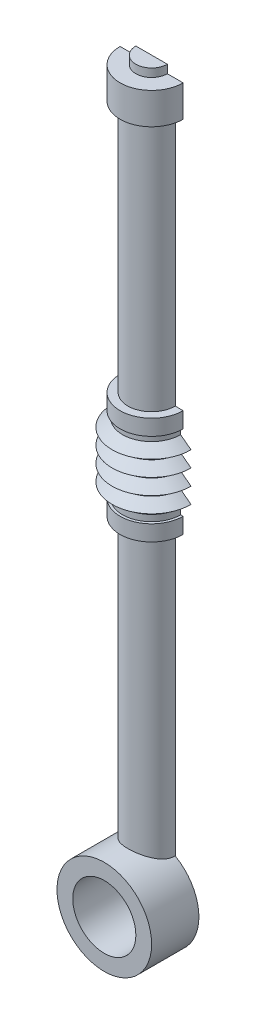
ISO-10303-21;
HEADER;
FILE_DESCRIPTION(('STEP AP214'),'2;1');
FILE_NAME('part.step','',(''),(''),'','','');
FILE_SCHEMA(('AUTOMOTIVE_DESIGN { 1 0 10303 214 1 1 1 1 }'));
ENDSEC;
DATA;
#1=APPLICATION_CONTEXT('core data for automotive mechanical design processes');
#2=APPLICATION_PROTOCOL_DEFINITION('international standard','automotive_design',2000,#1);
#3=PRODUCT_CONTEXT('',#1,'mechanical');
#4=PRODUCT('Part','Part','',(#3));
#5=PRODUCT_RELATED_PRODUCT_CATEGORY('part','',(#4));
#6=PRODUCT_DEFINITION_FORMATION('','',#4);
#7=PRODUCT_DEFINITION_CONTEXT('part definition',#1,'design');
#8=PRODUCT_DEFINITION('design','',#6,#7);
#9=PRODUCT_DEFINITION_SHAPE('','',#8);
#10=(LENGTH_UNIT() NAMED_UNIT(*) SI_UNIT(.MILLI.,.METRE.));
#11=(NAMED_UNIT(*) PLANE_ANGLE_UNIT() SI_UNIT($,.RADIAN.));
#12=(NAMED_UNIT(*) SI_UNIT($,.STERADIAN.) SOLID_ANGLE_UNIT());
#13=UNCERTAINTY_MEASURE_WITH_UNIT(LENGTH_MEASURE(1.E-05),#10,'distance_accuracy_value','');
#14=(GEOMETRIC_REPRESENTATION_CONTEXT(3) GLOBAL_UNCERTAINTY_ASSIGNED_CONTEXT((#13)) GLOBAL_UNIT_ASSIGNED_CONTEXT((#10,
#11,#12)) REPRESENTATION_CONTEXT('',''));
#15=CARTESIAN_POINT('',(0.,0.,0.));
#16=DIRECTION('',(0.,0.,1.));
#17=DIRECTION('',(1.,0.,0.));
#18=AXIS2_PLACEMENT_3D('',#15,#16,#17);
#19=CARTESIAN_POINT('',(0.,0.,-2.38125));
#20=DIRECTION('',(0.,0.,1.));
#21=DIRECTION('',(1.,0.,0.));
#22=AXIS2_PLACEMENT_3D('',#19,#20,#21);
#23=CYLINDRICAL_SURFACE('',#22,4.7625);
#24=CARTESIAN_POINT('',(0.,0.,0.));
#25=DIRECTION('',(0.,0.,1.));
#26=DIRECTION('',(1.,0.,0.));
#27=AXIS2_PLACEMENT_3D('',#24,#25,#26);
#28=CIRCLE('',#27,4.7625);
#29=CARTESIAN_POINT('',(2.38125,4.12444598552338,0.));
#30=VERTEX_POINT('',#29);
#31=CARTESIAN_POINT('',(-2.38125,4.12444598552338,0.));
#32=VERTEX_POINT('',#31);
#33=EDGE_CURVE('E53',#30,#32,#28,.F.);
#34=ORIENTED_EDGE('',*,*,#33,.F.);
#35=CARTESIAN_POINT('',(0.,4.7625,2.38125));
#36=CARTESIAN_POINT('',(-0.125183914923426,4.76249216616824,2.38124079022415));
#37=CARTESIAN_POINT('',(-0.250522391801445,4.75751079676351,2.37131965241024));
#38=CARTESIAN_POINT('',(-0.497492135528296,4.73807236179371,2.33207069034315));
#39=CARTESIAN_POINT('',(-0.61911590225731,4.72359730146256,2.30270601091892));
#40=CARTESIAN_POINT('',(-0.854710283828683,4.68668758103659,2.2260071468603));
#41=CARTESIAN_POINT('',(-0.968708640458038,4.66428387601664,2.17874279663695));
#42=CARTESIAN_POINT('',(-1.18698797780686,4.6135713226785,2.06794748374516));
#43=CARTESIAN_POINT('',(-1.29126972381591,4.58526293998811,2.0044178036293));
#44=CARTESIAN_POINT('',(-1.49425297381025,4.52333339410727,1.8585245421104));
#45=CARTESIAN_POINT('',(-1.59223521685329,4.48949442770284,1.77525406928113));
#46=CARTESIAN_POINT('',(-1.77350605772424,4.42102804302336,1.59419572957401));
#47=CARTESIAN_POINT('',(-1.85678345855757,4.3864000463997,1.49639690352979));
#48=CARTESIAN_POINT('',(-2.01275632468803,4.31718127493204,1.27996152334087));
#49=CARTESIAN_POINT('',(-2.08413032991234,4.2828016396047,1.16029716565166));
#50=CARTESIAN_POINT('',(-2.2054380906532,4.22162236963736,0.90876278134485));
#51=CARTESIAN_POINT('',(-2.25538716198478,4.19481732492304,0.776901556021107));
#52=CARTESIAN_POINT('',(-2.32917787787114,4.1542779588081,0.512766217674418));
#53=CARTESIAN_POINT('',(-2.35440344714868,4.13985721707925,0.380989398503949));
#54=CARTESIAN_POINT('',(-2.38226677784078,4.12389375440723,0.114350392548179));
#55=CARTESIAN_POINT('',(-2.38492686044446,4.12233830748904,-0.0205086129467756));
#56=CARTESIAN_POINT('',(-2.36859910257368,4.13172902674897,-0.272143595403314));
#57=CARTESIAN_POINT('',(-2.35216198239562,4.14120243470123,-0.389153474350517));
#58=CARTESIAN_POINT('',(-2.30252551556825,4.16900269672528,-0.618462796693928));
#59=CARTESIAN_POINT('',(-2.26932082940667,4.1873323709318,-0.730760727258112));
#60=CARTESIAN_POINT('',(-2.18648703954377,4.23118303207826,-0.95066437192215));
#61=CARTESIAN_POINT('',(-2.13649337856986,4.25686158081143,-1.05809986210871));
#62=CARTESIAN_POINT('',(-2.02178051875954,4.31252481445096,-1.26357290922991));
#63=CARTESIAN_POINT('',(-1.95705470557847,4.3425114313283,-1.3616062166477));
#64=CARTESIAN_POINT('',(-1.80514479326104,4.40800707257198,-1.55857873309482));
#65=CARTESIAN_POINT('',(-1.71615367899184,4.44373421251251,-1.65605668020323));
#66=CARTESIAN_POINT('',(-1.5229417218779,4.51360277984095,-1.83531371551958));
#67=CARTESIAN_POINT('',(-1.41871364221752,4.54774344351895,-1.91708530103068));
#68=CARTESIAN_POINT('',(-1.19185492951209,4.61252857217558,-2.06617648032704));
#69=CARTESIAN_POINT('',(-1.06859448999609,4.6429370603578,-2.13264862501142));
#70=CARTESIAN_POINT('',(-0.810735175632698,4.69482204419958,-2.24336855040867));
#71=CARTESIAN_POINT('',(-0.676145403481687,4.71630562984336,-2.28763397806736));
#72=CARTESIAN_POINT('',(-0.411400208267049,4.74641069721793,-2.34904455510034));
#73=CARTESIAN_POINT('',(-0.281800769618209,4.75595009329994,-2.36813225512202));
#74=CARTESIAN_POINT('',(-0.0209064223793881,4.7642386329949,-2.384737891014));
#75=CARTESIAN_POINT('',(0.110387653565244,4.7629928883014,-2.38226604517899));
#76=CARTESIAN_POINT('',(0.360123514541608,4.75038401553492,-2.35694532320286));
#77=CARTESIAN_POINT('',(0.478772715418814,4.73981253794951,-2.33569065643669));
#78=CARTESIAN_POINT('',(0.710581412294078,4.71064045443463,-2.27590809129975));
#79=CARTESIAN_POINT('',(0.823740301552203,4.69203896333817,-2.23737828863266));
#80=CARTESIAN_POINT('',(1.04510349887023,4.64782498678607,-2.14312865180629));
#81=CARTESIAN_POINT('',(1.15307363286889,4.62202724713937,-2.08694881191042));
#82=CARTESIAN_POINT('',(1.35841111754757,4.56590338843347,-1.95951268074179));
#83=CARTESIAN_POINT('',(1.45577392465991,4.53557534193758,-1.88824996699537));
#84=CARTESIAN_POINT('',(1.64727181011511,4.46980202056836,-1.72459548718051));
#85=CARTESIAN_POINT('',(1.7401510102877,4.4341466953364,-1.63081604451219));
#86=CARTESIAN_POINT('',(1.90942036468315,4.36393570018444,-1.42892823352271));
#87=CARTESIAN_POINT('',(1.98579911229707,4.32938080496145,-1.32081003575388));
#88=CARTESIAN_POINT('',(2.12337947127906,4.2636565144193,-1.0866985484896));
#89=CARTESIAN_POINT('',(2.18366696159152,4.23273211084819,-0.960093172570528));
#90=CARTESIAN_POINT('',(2.28143472953946,4.18085759649541,-0.696491651629047));
#91=CARTESIAN_POINT('',(2.3189443944635,4.15989464137303,-0.559509152757374));
#92=CARTESIAN_POINT('',(2.36663314232661,4.13293324320619,-0.29310753161418));
#93=CARTESIAN_POINT('',(2.37909019428893,4.12569144386626,-0.164224683502319));
#94=CARTESIAN_POINT('',(2.3828910522584,4.12350000729882,0.0939333281807322));
#95=CARTESIAN_POINT('',(2.37424400991589,4.12854504196533,0.223208297429794));
#96=CARTESIAN_POINT('',(2.33821157512933,4.14903909044237,0.465495089724903));
#97=CARTESIAN_POINT('',(2.31268975773311,4.16345118862044,0.578883000588989));
#98=CARTESIAN_POINT('',(2.24593636258125,4.19983482171594,0.799643078320496));
#99=CARTESIAN_POINT('',(2.20469973139119,4.22180878809312,0.907013297317141));
#100=CARTESIAN_POINT('',(2.10458608148048,4.27264188427817,1.12067545046553));
#101=CARTESIAN_POINT('',(2.04471002356456,4.30186440868521,1.2264102837776));
#102=CARTESIAN_POINT('',(1.91012262489561,4.36329131541278,1.42702239668615));
#103=CARTESIAN_POINT('',(1.83540356597009,4.39549724439656,1.52189398690387));
#104=CARTESIAN_POINT('',(1.66259405491127,4.46394665051477,1.71007598397153));
#105=CARTESIAN_POINT('',(1.56276696401922,4.50020523168019,1.80179601937323));
#106=CARTESIAN_POINT('',(1.34816645613201,4.56908865882827,1.96753719658021));
#107=CARTESIAN_POINT('',(1.23338503411081,4.60171154114937,2.0415487984721));
#108=CARTESIAN_POINT('',(0.990398154568059,4.66006004858537,2.16988737295861));
#109=CARTESIAN_POINT('',(0.862103521645129,4.68573527644208,2.22407146731469));
#110=CARTESIAN_POINT('',(0.663253095567626,4.71657007779491,2.28808012549976));
#111=CARTESIAN_POINT('',(0.595951068853118,4.72556504162985,2.30653151659672));
#112=CARTESIAN_POINT('',(0.459699357941892,4.74075563729533,2.33749781582299));
#113=CARTESIAN_POINT('',(0.390750707345512,4.74695297899059,2.35001635025922));
#114=CARTESIAN_POINT('',(0.268146547102141,4.75524386229739,2.36671244235111));
#115=CARTESIAN_POINT('',(0.21470159582656,4.75795932264298,2.37215832704609));
#116=CARTESIAN_POINT('',(0.107513940854614,4.761589098815,2.37942913381609));
#117=CARTESIAN_POINT('',(0.0537712289809023,4.76250336492721,2.38125395594727));
#118=CARTESIAN_POINT('',(0.,4.7625,2.38125));
#119=B_SPLINE_CURVE_WITH_KNOTS('',3,(#35,#36,#37,#38,#39,#40,#41,#42,#43,#44,#45,#46,#47,#48,
#49,#50,#51,#52,#53,#54,#55,#56,#57,#58,#59,#60,#61,#62,#63,#64,#65,#66,#67,#68,#69,#70,#71,#72,
#73,#74,#75,#76,#77,#78,#79,#80,#81,#82,#83,#84,#85,#86,#87,#88,#89,#90,#91,#92,#93,#94,#95,#96,
#97,#98,#99,#100,#101,#102,#103,#104,#105,#106,#107,#108,#109,#110,#111,#112,#113,#114,#115,
#116,#117,#118),.UNSPECIFIED.,.T.,.F.,(4,2,2,2,2,2,2,2,2,2,2,2,2,2,2,2,2,2,2,2,2,2,2,2,2,2,2,2,
2,2,2,2,2,2,2,2,2,2,2,2,2,4),(0.,0.375342762982071,0.751399031495027,1.12600300776604,
1.50057745488486,1.89781281294745,2.29534935341367,2.7237148606323,3.15177363432781,
3.55420641408922,3.9562410713973,4.31019852674695,4.66426876848022,5.0265863440121,
5.38906691250903,5.79750891551298,6.20614554263122,6.63375821648137,7.06103054022366,
7.45291460434892,7.84461294242952,8.20595196117703,8.56733082133655,8.93904238416433,
9.31091254594483,9.71930072847022,10.127970328905,10.5564308689761,10.984337440701,
11.3711666349163,11.7578281130277,12.1076544640509,12.4575934042726,12.8310431270806,
13.2046875497327,13.6237323431551,14.0430023792659,14.4652368253627,14.6760580296016,
14.8867502080478,15.0479696796956,15.2091936010515),.UNSPECIFIED.);
#120=EDGE_CURVE('E262',#30,#32,#119,.T.);
#121=ORIENTED_EDGE('',*,*,#120,.T.);
#122=EDGE_LOOP('',(#34,#121));
#123=FACE_BOUND('',#122,.T.);
#124=CARTESIAN_POINT('',(0.,0.,4.7625));
#125=DIRECTION('',(0.,0.,1.));
#126=DIRECTION('',(1.,0.,0.));
#127=AXIS2_PLACEMENT_3D('',#124,#125,#126);
#128=CIRCLE('',#127,4.7625);
#129=CARTESIAN_POINT('',(4.7625,0.,4.7625));
#130=VERTEX_POINT('',#129);
#131=EDGE_CURVE('E40',#130,#130,#128,.T.);
#132=ORIENTED_EDGE('',*,*,#131,.F.);
#133=EDGE_LOOP('',(#132));
#134=FACE_BOUND('',#133,.T.);
#135=ADVANCED_FACE('F33',(#123,#134),#23,.T.);
#136=CARTESIAN_POINT('',(0.,0.,-2.38125));
#137=DIRECTION('',(0.,0.,1.));
#138=DIRECTION('',(1.,0.,0.));
#139=AXIS2_PLACEMENT_3D('',#136,#137,#138);
#140=CYLINDRICAL_SURFACE('',#139,3.175);
#141=CARTESIAN_POINT('',(0.,0.,0.));
#142=DIRECTION('',(0.,0.,1.));
#143=DIRECTION('',(1.,0.,0.));
#144=AXIS2_PLACEMENT_3D('',#141,#142,#143);
#145=CIRCLE('',#144,3.175);
#146=CARTESIAN_POINT('',(3.175,0.,0.));
#147=VERTEX_POINT('',#146);
#148=EDGE_CURVE('E203',#147,#147,#145,.F.);
#149=CARTESIAN_POINT('',(0.,0.,4.7625));
#150=DIRECTION('',(0.,0.,1.));
#151=DIRECTION('',(1.,0.,0.));
#152=AXIS2_PLACEMENT_3D('',#149,#150,#151);
#153=CIRCLE('',#152,3.175);
#154=CARTESIAN_POINT('',(3.175,0.,4.7625));
#155=VERTEX_POINT('',#154);
#156=EDGE_CURVE('E269',#155,#155,#153,.T.);
#157=CARTESIAN_POINT('',(3.175,0.,0.));
#158=CARTESIAN_POINT('',(3.175,0.,0.049609375));
#159=CARTESIAN_POINT('',(3.175,0.,0.0992187500000001));
#160=CARTESIAN_POINT('',(3.175,0.,0.1984375));
#161=CARTESIAN_POINT('',(3.175,0.,0.248046875));
#162=CARTESIAN_POINT('',(3.175,0.,0.347265625));
#163=CARTESIAN_POINT('',(3.175,0.,0.396875));
#164=CARTESIAN_POINT('',(3.175,0.,0.49609375));
#165=CARTESIAN_POINT('',(3.175,0.,0.545703125));
#166=CARTESIAN_POINT('',(3.175,0.,0.644921875));
#167=CARTESIAN_POINT('',(3.175,0.,0.69453125));
#168=CARTESIAN_POINT('',(3.175,0.,0.79375));
#169=CARTESIAN_POINT('',(3.175,0.,0.843359375));
#170=CARTESIAN_POINT('',(3.175,0.,0.942578125));
#171=CARTESIAN_POINT('',(3.175,0.,0.9921875));
#172=CARTESIAN_POINT('',(3.175,0.,1.09140625));
#173=CARTESIAN_POINT('',(3.175,0.,1.141015625));
#174=CARTESIAN_POINT('',(3.175,0.,1.240234375));
#175=CARTESIAN_POINT('',(3.175,0.,1.28984375));
#176=CARTESIAN_POINT('',(3.175,0.,1.3890625));
#177=CARTESIAN_POINT('',(3.175,0.,1.438671875));
#178=CARTESIAN_POINT('',(3.175,0.,1.537890625));
#179=CARTESIAN_POINT('',(3.175,0.,1.5875));
#180=CARTESIAN_POINT('',(3.175,0.,1.68671875));
#181=CARTESIAN_POINT('',(3.175,0.,1.736328125));
#182=CARTESIAN_POINT('',(3.175,0.,1.835546875));
#183=CARTESIAN_POINT('',(3.175,0.,1.88515625));
#184=CARTESIAN_POINT('',(3.175,0.,1.984375));
#185=CARTESIAN_POINT('',(3.175,0.,2.033984375));
#186=CARTESIAN_POINT('',(3.175,0.,2.133203125));
#187=CARTESIAN_POINT('',(3.175,0.,2.1828125));
#188=CARTESIAN_POINT('',(3.175,0.,2.28203125));
#189=CARTESIAN_POINT('',(3.175,0.,2.331640625));
#190=CARTESIAN_POINT('',(3.175,0.,2.430859375));
#191=CARTESIAN_POINT('',(3.175,0.,2.48046875));
#192=CARTESIAN_POINT('',(3.175,0.,2.5796875));
#193=CARTESIAN_POINT('',(3.175,0.,2.629296875));
#194=CARTESIAN_POINT('',(3.175,0.,2.728515625));
#195=CARTESIAN_POINT('',(3.175,0.,2.778125));
#196=CARTESIAN_POINT('',(3.175,0.,2.87734375));
#197=CARTESIAN_POINT('',(3.175,0.,2.926953125));
#198=CARTESIAN_POINT('',(3.175,0.,3.026171875));
#199=CARTESIAN_POINT('',(3.175,0.,3.07578125));
#200=CARTESIAN_POINT('',(3.175,0.,3.175));
#201=CARTESIAN_POINT('',(3.175,0.,3.224609375));
#202=CARTESIAN_POINT('',(3.175,0.,3.323828125));
#203=CARTESIAN_POINT('',(3.175,0.,3.3734375));
#204=CARTESIAN_POINT('',(3.175,0.,3.47265625));
#205=CARTESIAN_POINT('',(3.175,0.,3.522265625));
#206=CARTESIAN_POINT('',(3.175,0.,3.621484375));
#207=CARTESIAN_POINT('',(3.175,0.,3.67109375));
#208=CARTESIAN_POINT('',(3.175,0.,3.7703125));
#209=CARTESIAN_POINT('',(3.175,0.,3.819921875));
#210=CARTESIAN_POINT('',(3.175,0.,3.919140625));
#211=CARTESIAN_POINT('',(3.175,0.,3.96875));
#212=CARTESIAN_POINT('',(3.175,0.,4.06796875));
#213=CARTESIAN_POINT('',(3.175,0.,4.117578125));
#214=CARTESIAN_POINT('',(3.175,0.,4.216796875));
#215=CARTESIAN_POINT('',(3.175,0.,4.26640625));
#216=CARTESIAN_POINT('',(3.175,0.,4.365625));
#217=CARTESIAN_POINT('',(3.175,0.,4.415234375));
#218=CARTESIAN_POINT('',(3.175,0.,4.514453125));
#219=CARTESIAN_POINT('',(3.175,0.,4.5640625));
#220=CARTESIAN_POINT('',(3.175,0.,4.66328125));
#221=CARTESIAN_POINT('',(3.175,0.,4.712890625));
#222=CARTESIAN_POINT('',(3.175,0.,4.7625));
#223=B_SPLINE_CURVE_WITH_KNOTS('',3,(#157,#158,#159,#160,#161,#162,#163,#164,#165,#166,#167,
#168,#169,#170,#171,#172,#173,#174,#175,#176,#177,#178,#179,#180,#181,#182,#183,#184,#185,#186,
#187,#188,#189,#190,#191,#192,#193,#194,#195,#196,#197,#198,#199,#200,#201,#202,#203,#204,#205,
#206,#207,#208,#209,#210,#211,#212,#213,#214,#215,#216,#217,#218,#219,#220,#221,#222),
.UNSPECIFIED.,.F.,.F.,(4,2,2,2,2,2,2,2,2,2,2,2,2,2,2,2,2,2,2,2,2,2,2,2,2,2,2,2,2,2,2,2,4),(0.,
0.148828125,0.29765625,0.446484375,0.5953125,0.744140625,0.89296875,1.041796875,1.190625,
1.339453125,1.48828125,1.637109375,1.7859375,1.934765625,2.08359375,2.232421875,2.38125,
2.530078125,2.67890625,2.827734375,2.9765625,3.125390625,3.27421875,3.423046875,3.571875,
3.720703125,3.86953125,4.018359375,4.1671875,4.316015625,4.46484375,4.613671875,4.7625),.UNSPECIFIED.);
#224=EDGE_CURVE('BSEAM365',#147,#155,#223,.T.);
#225=ORIENTED_EDGE('',*,*,#148,.T.);
#226=ORIENTED_EDGE('',*,*,#156,.T.);
#227=ORIENTED_EDGE('',*,*,#224,.T.);
#228=ORIENTED_EDGE('',*,*,#224,.F.);
#229=EDGE_LOOP('',(#225,#227,#226,#228));
#230=FACE_BOUND('',#229,.T.);
#231=ADVANCED_FACE('F365',(#230),#140,.F.);
#232=CARTESIAN_POINT('',(0.,0.,4.7625));
#233=DIRECTION('',(0.,0.,1.));
#234=DIRECTION('',(1.,0.,0.));
#235=AXIS2_PLACEMENT_3D('',#232,#233,#234);
#236=PLANE('',#235);
#237=ORIENTED_EDGE('',*,*,#131,.T.);
#238=EDGE_LOOP('',(#237));
#239=FACE_BOUND('',#238,.T.);
#240=ORIENTED_EDGE('',*,*,#156,.F.);
#241=EDGE_LOOP('',(#240));
#242=FACE_BOUND('',#241,.T.);
#243=ADVANCED_FACE('F371',(#239,#242),#236,.T.);
#244=CARTESIAN_POINT('',(0.,33.3375,0.));
#245=DIRECTION('',(0.,-1.,0.));
#246=DIRECTION('',(0.,0.,-1.));
#247=AXIS2_PLACEMENT_3D('',#244,#245,#246);
#248=CYLINDRICAL_SURFACE('',#247,2.38125);
#249=CARTESIAN_POINT('',(0.,32.54375,0.));
#250=DIRECTION('',(0.,-1.,0.));
#251=DIRECTION('',(0.,0.,-1.));
#252=AXIS2_PLACEMENT_3D('',#249,#250,#251);
#253=CIRCLE('',#252,2.38125);
#254=CARTESIAN_POINT('',(2.38125,32.54375,0.));
#255=VERTEX_POINT('',#254);
#256=CARTESIAN_POINT('',(-2.38125,32.54375,0.));
#257=VERTEX_POINT('',#256);
#258=EDGE_CURVE('E261',#255,#257,#253,.T.);
#259=ORIENTED_EDGE('',*,*,#258,.T.);
#260=DIRECTION('',(0.,-1.,0.));
#261=VECTOR('',#260,1.);
#262=CARTESIAN_POINT('',(-2.38125,33.3375,0.));
#263=LINE('',#262,#261);
#264=EDGE_CURVE('E383',#257,#32,#263,.T.);
#265=ORIENTED_EDGE('',*,*,#264,.T.);
#266=ORIENTED_EDGE('',*,*,#120,.F.);
#267=DIRECTION('',(0.,-1.,0.));
#268=VECTOR('',#267,1.);
#269=CARTESIAN_POINT('',(2.38125,33.3375,0.));
#270=LINE('',#269,#268);
#271=EDGE_CURVE('E384',#30,#255,#270,.F.);
#272=ORIENTED_EDGE('',*,*,#271,.T.);
#273=EDGE_LOOP('',(#259,#265,#266,#272));
#274=FACE_BOUND('',#273,.T.);
#275=ADVANCED_FACE('F279',(#274),#248,.T.);
#276=CARTESIAN_POINT('',(0.,32.54375,0.));
#277=DIRECTION('',(0.,-1.,0.));
#278=DIRECTION('',(0.,0.,-1.));
#279=AXIS2_PLACEMENT_3D('',#276,#277,#278);
#280=CYLINDRICAL_SURFACE('',#279,3.175);
#281=DIRECTION('',(0.,-1.,0.));
#282=VECTOR('',#281,1.);
#283=CARTESIAN_POINT('',(-3.175,32.54375,0.));
#284=LINE('',#283,#282);
#285=CARTESIAN_POINT('',(-3.175,32.54375,0.));
#286=VERTEX_POINT('',#285);
#287=CARTESIAN_POINT('',(-3.175,34.13125,0.));
#288=VERTEX_POINT('',#287);
#289=EDGE_CURVE('E391',#286,#288,#284,.F.);
#290=ORIENTED_EDGE('',*,*,#289,.F.);
#291=CARTESIAN_POINT('',(0.,32.54375,0.));
#292=DIRECTION('',(0.,-1.,0.));
#293=DIRECTION('',(0.,0.,-1.));
#294=AXIS2_PLACEMENT_3D('',#291,#292,#293);
#295=CIRCLE('',#294,3.175);
#296=CARTESIAN_POINT('',(3.175,32.54375,0.));
#297=VERTEX_POINT('',#296);
#298=EDGE_CURVE('E258',#297,#286,#295,.T.);
#299=ORIENTED_EDGE('',*,*,#298,.F.);
#300=DIRECTION('',(0.,-1.,0.));
#301=VECTOR('',#300,1.);
#302=CARTESIAN_POINT('',(3.175,32.54375,0.));
#303=LINE('',#302,#301);
#304=CARTESIAN_POINT('',(3.175,34.13125,0.));
#305=VERTEX_POINT('',#304);
#306=EDGE_CURVE('E393',#305,#297,#303,.T.);
#307=ORIENTED_EDGE('',*,*,#306,.F.);
#308=CARTESIAN_POINT('',(0.,34.13125,0.));
#309=DIRECTION('',(0.,-1.,0.));
#310=DIRECTION('',(0.,0.,-1.));
#311=AXIS2_PLACEMENT_3D('',#308,#309,#310);
#312=CIRCLE('',#311,3.175);
#313=EDGE_CURVE('E214',#305,#288,#312,.T.);
#314=ORIENTED_EDGE('',*,*,#313,.T.);
#315=EDGE_LOOP('',(#290,#299,#307,#314));
#316=FACE_BOUND('',#315,.T.);
#317=ADVANCED_FACE('F275',(#316),#280,.T.);
#318=CARTESIAN_POINT('',(0.,32.54375,0.));
#319=DIRECTION('',(0.,-1.,0.));
#320=DIRECTION('',(0.,0.,-1.));
#321=AXIS2_PLACEMENT_3D('',#318,#319,#320);
#322=PLANE('',#321);
#323=DIRECTION('',(-1.,0.,0.));
#324=VECTOR('',#323,1.);
#325=CARTESIAN_POINT('',(0.,32.54375,0.));
#326=LINE('',#325,#324);
#327=EDGE_CURVE('E387',#297,#255,#326,.T.);
#328=ORIENTED_EDGE('',*,*,#327,.F.);
#329=ORIENTED_EDGE('',*,*,#298,.T.);
#330=EDGE_CURVE('E389',#257,#286,#326,.T.);
#331=ORIENTED_EDGE('',*,*,#330,.F.);
#332=ORIENTED_EDGE('',*,*,#258,.F.);
#333=EDGE_LOOP('',(#328,#329,#331,#332));
#334=FACE_BOUND('',#333,.T.);
#335=ADVANCED_FACE('F278',(#334),#322,.T.);
#336=CARTESIAN_POINT('',(0.,43.33875,0.));
#337=DIRECTION('',(0.,1.,0.));
#338=DIRECTION('',(0.,0.,1.));
#339=AXIS2_PLACEMENT_3D('',#336,#337,#338);
#340=PLANE('',#339);
#341=DIRECTION('',(1.,0.,0.));
#342=VECTOR('',#341,1.);
#343=CARTESIAN_POINT('',(0.,43.33875,0.));
#344=LINE('',#343,#342);
#345=CARTESIAN_POINT('',(-3.175,43.33875,0.));
#346=VERTEX_POINT('',#345);
#347=CARTESIAN_POINT('',(-2.38125,43.33875,0.));
#348=VERTEX_POINT('',#347);
#349=EDGE_CURVE('E614',#346,#348,#344,.T.);
#350=ORIENTED_EDGE('',*,*,#349,.F.);
#351=CARTESIAN_POINT('',(0.,43.33875,0.));
#352=DIRECTION('',(0.,-1.,0.));
#353=DIRECTION('',(0.,0.,-1.));
#354=AXIS2_PLACEMENT_3D('',#351,#352,#353);
#355=CIRCLE('',#354,3.175);
#356=CARTESIAN_POINT('',(3.175,43.33875,0.));
#357=VERTEX_POINT('',#356);
#358=EDGE_CURVE('E255',#357,#346,#355,.T.);
#359=ORIENTED_EDGE('',*,*,#358,.F.);
#360=CARTESIAN_POINT('',(2.38125,43.33875,0.));
#361=VERTEX_POINT('',#360);
#362=EDGE_CURVE('E615',#361,#357,#344,.T.);
#363=ORIENTED_EDGE('',*,*,#362,.F.);
#364=CARTESIAN_POINT('',(0.,43.33875,0.));
#365=DIRECTION('',(0.,1.,0.));
#366=DIRECTION('',(0.,0.,1.));
#367=AXIS2_PLACEMENT_3D('',#364,#365,#366);
#368=CIRCLE('',#367,2.38125);
#369=EDGE_CURVE('E209',#348,#361,#368,.T.);
#370=ORIENTED_EDGE('',*,*,#369,.F.);
#371=EDGE_LOOP('',(#350,#359,#363,#370));
#372=FACE_BOUND('',#371,.T.);
#373=ADVANCED_FACE('F283',(#372),#340,.T.);
#374=CARTESIAN_POINT('',(0.,32.54375,0.));
#375=DIRECTION('',(0.,-1.,0.));
#376=DIRECTION('',(0.,0.,-1.));
#377=AXIS2_PLACEMENT_3D('',#374,#375,#376);
#378=CYLINDRICAL_SURFACE('',#377,3.175);
#379=DIRECTION('',(0.,-1.,0.));
#380=VECTOR('',#379,1.);
#381=CARTESIAN_POINT('',(-3.175,32.54375,0.));
#382=LINE('',#381,#380);
#383=CARTESIAN_POINT('',(-3.175,41.75125,0.));
#384=VERTEX_POINT('',#383);
#385=EDGE_CURVE('E610',#384,#346,#382,.F.);
#386=ORIENTED_EDGE('',*,*,#385,.F.);
#387=CARTESIAN_POINT('',(0.,41.75125,0.));
#388=DIRECTION('',(0.,-1.,0.));
#389=DIRECTION('',(0.,0.,-1.));
#390=AXIS2_PLACEMENT_3D('',#387,#388,#389);
#391=CIRCLE('',#390,3.175);
#392=CARTESIAN_POINT('',(3.175,41.75125,0.));
#393=VERTEX_POINT('',#392);
#394=EDGE_CURVE('E252',#393,#384,#391,.T.);
#395=ORIENTED_EDGE('',*,*,#394,.F.);
#396=DIRECTION('',(0.,-1.,0.));
#397=VECTOR('',#396,1.);
#398=CARTESIAN_POINT('',(3.175,32.54375,0.));
#399=LINE('',#398,#397);
#400=EDGE_CURVE('E612',#357,#393,#399,.T.);
#401=ORIENTED_EDGE('',*,*,#400,.F.);
#402=ORIENTED_EDGE('',*,*,#358,.T.);
#403=EDGE_LOOP('',(#386,#395,#401,#402));
#404=FACE_BOUND('',#403,.T.);
#405=ADVANCED_FACE('F287',(#404),#378,.T.);
#406=CARTESIAN_POINT('',(0.,41.75125,0.));
#407=DIRECTION('',(0.,-1.,0.));
#408=DIRECTION('',(0.,0.,-1.));
#409=AXIS2_PLACEMENT_3D('',#406,#407,#408);
#410=PLANE('',#409);
#411=DIRECTION('',(-1.,0.,0.));
#412=VECTOR('',#411,1.);
#413=CARTESIAN_POINT('',(0.,41.75125,0.));
#414=LINE('',#413,#412);
#415=CARTESIAN_POINT('',(2.921,41.75125,0.));
#416=VERTEX_POINT('',#415);
#417=EDGE_CURVE('E607',#393,#416,#414,.T.);
#418=ORIENTED_EDGE('',*,*,#417,.F.);
#419=ORIENTED_EDGE('',*,*,#394,.T.);
#420=CARTESIAN_POINT('',(-2.921,41.75125,0.));
#421=VERTEX_POINT('',#420);
#422=EDGE_CURVE('E608',#421,#384,#414,.T.);
#423=ORIENTED_EDGE('',*,*,#422,.F.);
#424=CARTESIAN_POINT('',(0.,41.75125,0.));
#425=DIRECTION('',(0.,-1.,0.));
#426=DIRECTION('',(0.,0.,-1.));
#427=AXIS2_PLACEMENT_3D('',#424,#425,#426);
#428=CIRCLE('',#427,2.921);
#429=EDGE_CURVE('E249',#416,#421,#428,.T.);
#430=ORIENTED_EDGE('',*,*,#429,.F.);
#431=EDGE_LOOP('',(#418,#419,#423,#430));
#432=FACE_BOUND('',#431,.T.);
#433=ADVANCED_FACE('F291',(#432),#410,.T.);
#434=CARTESIAN_POINT('',(0.,32.54375,0.));
#435=DIRECTION('',(0.,-1.,0.));
#436=DIRECTION('',(0.,0.,-1.));
#437=AXIS2_PLACEMENT_3D('',#434,#435,#436);
#438=CYLINDRICAL_SURFACE('',#437,2.921);
#439=DIRECTION('',(0.,-1.,0.));
#440=VECTOR('',#439,1.);
#441=CARTESIAN_POINT('',(-2.921,32.54375,0.));
#442=LINE('',#441,#440);
#443=CARTESIAN_POINT('',(-2.921,41.11625,0.));
#444=VERTEX_POINT('',#443);
#445=EDGE_CURVE('E603',#444,#421,#442,.F.);
#446=ORIENTED_EDGE('',*,*,#445,.F.);
#447=CARTESIAN_POINT('',(0.,41.11625,0.));
#448=DIRECTION('',(0.,-1.,0.));
#449=DIRECTION('',(0.,0.,-1.));
#450=AXIS2_PLACEMENT_3D('',#447,#448,#449);
#451=CIRCLE('',#450,2.921);
#452=CARTESIAN_POINT('',(2.921,41.11625,0.));
#453=VERTEX_POINT('',#452);
#454=EDGE_CURVE('E246',#453,#444,#451,.T.);
#455=ORIENTED_EDGE('',*,*,#454,.F.);
#456=DIRECTION('',(0.,-1.,0.));
#457=VECTOR('',#456,1.);
#458=CARTESIAN_POINT('',(2.921,32.54375,0.));
#459=LINE('',#458,#457);
#460=EDGE_CURVE('E605',#416,#453,#459,.T.);
#461=ORIENTED_EDGE('',*,*,#460,.F.);
#462=ORIENTED_EDGE('',*,*,#429,.T.);
#463=EDGE_LOOP('',(#446,#455,#461,#462));
#464=FACE_BOUND('',#463,.T.);
#465=ADVANCED_FACE('F295',(#464),#438,.T.);
#466=CARTESIAN_POINT('',(0.,40.3225,0.));
#467=DIRECTION('',(0.,-1.,0.));
#468=DIRECTION('',(0.,0.,-1.));
#469=AXIS2_PLACEMENT_3D('',#466,#467,#468);
#470=CONICAL_SURFACE('',#469,3.96874999999999,0.922464337707633);
#471=DIRECTION('',(-0.797092148154008,-0.603857687995465,0.));
#472=VECTOR('',#471,1.);
#473=CARTESIAN_POINT('',(0.,43.3291287878788,0.));
#474=LINE('',#473,#472);
#475=CARTESIAN_POINT('',(-3.96874999999999,40.3225,0.));
#476=VERTEX_POINT('',#475);
#477=EDGE_CURVE('E599',#476,#444,#474,.F.);
#478=ORIENTED_EDGE('',*,*,#477,.F.);
#479=CARTESIAN_POINT('',(0.,40.3225,0.));
#480=DIRECTION('',(0.,-1.,0.));
#481=DIRECTION('',(0.,0.,-1.));
#482=AXIS2_PLACEMENT_3D('',#479,#480,#481);
#483=CIRCLE('',#482,3.96874999999999);
#484=CARTESIAN_POINT('',(3.96874999999999,40.3225,0.));
#485=VERTEX_POINT('',#484);
#486=EDGE_CURVE('E243',#485,#476,#483,.T.);
#487=ORIENTED_EDGE('',*,*,#486,.F.);
#488=DIRECTION('',(-0.797092148154008,0.603857687995465,0.));
#489=VECTOR('',#488,1.);
#490=CARTESIAN_POINT('',(0.,43.3291287878788,0.));
#491=LINE('',#490,#489);
#492=EDGE_CURVE('E601',#453,#485,#491,.F.);
#493=ORIENTED_EDGE('',*,*,#492,.F.);
#494=ORIENTED_EDGE('',*,*,#454,.T.);
#495=EDGE_LOOP('',(#478,#487,#493,#494));
#496=FACE_BOUND('',#495,.T.);
#497=ADVANCED_FACE('F299',(#496),#470,.T.);
#498=CARTESIAN_POINT('',(0.,39.52875,0.));
#499=DIRECTION('',(0.,1.,0.));
#500=DIRECTION('',(0.,0.,1.));
#501=AXIS2_PLACEMENT_3D('',#498,#499,#500);
#502=CONICAL_SURFACE('',#501,2.921,0.922464337707645);
#503=DIRECTION('',(0.797092148154016,0.603857687995455,0.));
#504=VECTOR('',#503,1.);
#505=CARTESIAN_POINT('',(0.,37.3158712121213,0.));
#506=LINE('',#505,#504);
#507=CARTESIAN_POINT('',(2.921,39.52875,0.));
#508=VERTEX_POINT('',#507);
#509=EDGE_CURVE('E595',#485,#508,#506,.F.);
#510=ORIENTED_EDGE('',*,*,#509,.F.);
#511=ORIENTED_EDGE('',*,*,#486,.T.);
#512=DIRECTION('',(0.797092148154016,-0.603857687995455,0.));
#513=VECTOR('',#512,1.);
#514=CARTESIAN_POINT('',(0.,37.3158712121213,0.));
#515=LINE('',#514,#513);
#516=CARTESIAN_POINT('',(-2.921,39.52875,0.));
#517=VERTEX_POINT('',#516);
#518=EDGE_CURVE('E597',#517,#476,#515,.F.);
#519=ORIENTED_EDGE('',*,*,#518,.F.);
#520=CARTESIAN_POINT('',(0.,39.52875,0.));
#521=DIRECTION('',(0.,-1.,0.));
#522=DIRECTION('',(0.,0.,-1.));
#523=AXIS2_PLACEMENT_3D('',#520,#521,#522);
#524=CIRCLE('',#523,2.921);
#525=EDGE_CURVE('E240',#508,#517,#524,.T.);
#526=ORIENTED_EDGE('',*,*,#525,.F.);
#527=EDGE_LOOP('',(#510,#511,#519,#526));
#528=FACE_BOUND('',#527,.T.);
#529=ADVANCED_FACE('F303',(#528),#502,.T.);
#530=CARTESIAN_POINT('',(0.,38.735,0.));
#531=DIRECTION('',(0.,-1.,0.));
#532=DIRECTION('',(0.,0.,-1.));
#533=AXIS2_PLACEMENT_3D('',#530,#531,#532);
#534=CONICAL_SURFACE('',#533,3.96875,0.922464337707637);
#535=DIRECTION('',(-0.797092148154011,-0.603857687995461,0.));
#536=VECTOR('',#535,1.);
#537=CARTESIAN_POINT('',(0.,41.7416287878788,0.));
#538=LINE('',#537,#536);
#539=CARTESIAN_POINT('',(-3.96875,38.735,0.));
#540=VERTEX_POINT('',#539);
#541=EDGE_CURVE('E591',#540,#517,#538,.F.);
#542=ORIENTED_EDGE('',*,*,#541,.F.);
#543=CARTESIAN_POINT('',(0.,38.735,0.));
#544=DIRECTION('',(0.,-1.,0.));
#545=DIRECTION('',(0.,0.,-1.));
#546=AXIS2_PLACEMENT_3D('',#543,#544,#545);
#547=CIRCLE('',#546,3.96875);
#548=CARTESIAN_POINT('',(3.96875,38.735,0.));
#549=VERTEX_POINT('',#548);
#550=EDGE_CURVE('E237',#549,#540,#547,.T.);
#551=ORIENTED_EDGE('',*,*,#550,.F.);
#552=DIRECTION('',(-0.797092148154011,0.603857687995461,0.));
#553=VECTOR('',#552,1.);
#554=CARTESIAN_POINT('',(0.,41.7416287878788,0.));
#555=LINE('',#554,#553);
#556=EDGE_CURVE('E593',#508,#549,#555,.F.);
#557=ORIENTED_EDGE('',*,*,#556,.F.);
#558=ORIENTED_EDGE('',*,*,#525,.T.);
#559=EDGE_LOOP('',(#542,#551,#557,#558));
#560=FACE_BOUND('',#559,.T.);
#561=ADVANCED_FACE('F307',(#560),#534,.T.);
#562=CARTESIAN_POINT('',(0.,37.94125,0.));
#563=DIRECTION('',(0.,1.,0.));
#564=DIRECTION('',(0.,0.,1.));
#565=AXIS2_PLACEMENT_3D('',#562,#563,#564);
#566=CONICAL_SURFACE('',#565,2.921,0.92246433770763);
#567=DIRECTION('',(0.797092148154007,0.603857687995467,0.));
#568=VECTOR('',#567,1.);
#569=CARTESIAN_POINT('',(0.,35.7283712121212,0.));
#570=LINE('',#569,#568);
#571=CARTESIAN_POINT('',(2.921,37.94125,0.));
#572=VERTEX_POINT('',#571);
#573=EDGE_CURVE('E587',#549,#572,#570,.F.);
#574=ORIENTED_EDGE('',*,*,#573,.F.);
#575=ORIENTED_EDGE('',*,*,#550,.T.);
#576=DIRECTION('',(0.797092148154007,-0.603857687995467,0.));
#577=VECTOR('',#576,1.);
#578=CARTESIAN_POINT('',(0.,35.7283712121212,0.));
#579=LINE('',#578,#577);
#580=CARTESIAN_POINT('',(-2.921,37.94125,0.));
#581=VERTEX_POINT('',#580);
#582=EDGE_CURVE('E589',#581,#540,#579,.F.);
#583=ORIENTED_EDGE('',*,*,#582,.F.);
#584=CARTESIAN_POINT('',(0.,37.94125,0.));
#585=DIRECTION('',(0.,-1.,0.));
#586=DIRECTION('',(0.,0.,-1.));
#587=AXIS2_PLACEMENT_3D('',#584,#585,#586);
#588=CIRCLE('',#587,2.921);
#589=EDGE_CURVE('E234',#572,#581,#588,.T.);
#590=ORIENTED_EDGE('',*,*,#589,.F.);
#591=EDGE_LOOP('',(#574,#575,#583,#590));
#592=FACE_BOUND('',#591,.T.);
#593=ADVANCED_FACE('F311',(#592),#566,.T.);
#594=CARTESIAN_POINT('',(0.,37.1475,0.));
#595=DIRECTION('',(0.,-1.,0.));
#596=DIRECTION('',(0.,0.,-1.));
#597=AXIS2_PLACEMENT_3D('',#594,#595,#596);
#598=CONICAL_SURFACE('',#597,3.96875,0.922464337707645);
#599=DIRECTION('',(-0.797092148154016,-0.603857687995455,0.));
#600=VECTOR('',#599,1.);
#601=CARTESIAN_POINT('',(0.,40.1541287878787,0.));
#602=LINE('',#601,#600);
#603=CARTESIAN_POINT('',(-3.96875,37.1475,0.));
#604=VERTEX_POINT('',#603);
#605=EDGE_CURVE('E583',#604,#581,#602,.F.);
#606=ORIENTED_EDGE('',*,*,#605,.F.);
#607=CARTESIAN_POINT('',(0.,37.1475,0.));
#608=DIRECTION('',(0.,-1.,0.));
#609=DIRECTION('',(0.,0.,-1.));
#610=AXIS2_PLACEMENT_3D('',#607,#608,#609);
#611=CIRCLE('',#610,3.96875);
#612=CARTESIAN_POINT('',(3.96875,37.1475,0.));
#613=VERTEX_POINT('',#612);
#614=EDGE_CURVE('E231',#613,#604,#611,.T.);
#615=ORIENTED_EDGE('',*,*,#614,.F.);
#616=DIRECTION('',(-0.797092148154016,0.603857687995455,0.));
#617=VECTOR('',#616,1.);
#618=CARTESIAN_POINT('',(0.,40.1541287878787,0.));
#619=LINE('',#618,#617);
#620=EDGE_CURVE('E585',#572,#613,#619,.F.);
#621=ORIENTED_EDGE('',*,*,#620,.F.);
#622=ORIENTED_EDGE('',*,*,#589,.T.);
#623=EDGE_LOOP('',(#606,#615,#621,#622));
#624=FACE_BOUND('',#623,.T.);
#625=ADVANCED_FACE('F315',(#624),#598,.T.);
#626=CARTESIAN_POINT('',(0.,36.35375,0.));
#627=DIRECTION('',(0.,1.,0.));
#628=DIRECTION('',(0.,0.,1.));
#629=AXIS2_PLACEMENT_3D('',#626,#627,#628);
#630=CONICAL_SURFACE('',#629,2.921,0.92246433770763);
#631=DIRECTION('',(0.797092148154007,0.603857687995467,0.));
#632=VECTOR('',#631,1.);
#633=CARTESIAN_POINT('',(0.,34.1408712121212,0.));
#634=LINE('',#633,#632);
#635=CARTESIAN_POINT('',(2.92099999999999,36.35375,0.));
#636=VERTEX_POINT('',#635);
#637=EDGE_CURVE('E579',#613,#636,#634,.F.);
#638=ORIENTED_EDGE('',*,*,#637,.F.);
#639=ORIENTED_EDGE('',*,*,#614,.T.);
#640=DIRECTION('',(0.797092148154007,-0.603857687995467,0.));
#641=VECTOR('',#640,1.);
#642=CARTESIAN_POINT('',(0.,34.1408712121212,0.));
#643=LINE('',#642,#641);
#644=CARTESIAN_POINT('',(-2.92099999999999,36.35375,0.));
#645=VERTEX_POINT('',#644);
#646=EDGE_CURVE('E581',#645,#604,#643,.F.);
#647=ORIENTED_EDGE('',*,*,#646,.F.);
#648=CARTESIAN_POINT('',(0.,36.35375,0.));
#649=DIRECTION('',(0.,-1.,0.));
#650=DIRECTION('',(0.,0.,-1.));
#651=AXIS2_PLACEMENT_3D('',#648,#649,#650);
#652=CIRCLE('',#651,2.921);
#653=EDGE_CURVE('E228',#636,#645,#652,.T.);
#654=ORIENTED_EDGE('',*,*,#653,.F.);
#655=EDGE_LOOP('',(#638,#639,#647,#654));
#656=FACE_BOUND('',#655,.T.);
#657=ADVANCED_FACE('F319',(#656),#630,.T.);
#658=CARTESIAN_POINT('',(0.,35.56,0.));
#659=DIRECTION('',(0.,-1.,0.));
#660=DIRECTION('',(0.,0.,-1.));
#661=AXIS2_PLACEMENT_3D('',#658,#659,#660);
#662=CONICAL_SURFACE('',#661,3.96875,0.92246433770764);
#663=DIRECTION('',(-0.797092148154013,-0.603857687995459,0.));
#664=VECTOR('',#663,1.);
#665=CARTESIAN_POINT('',(0.,38.5666287878788,0.));
#666=LINE('',#665,#664);
#667=CARTESIAN_POINT('',(-3.96875,35.56,0.));
#668=VERTEX_POINT('',#667);
#669=EDGE_CURVE('E575',#668,#645,#666,.F.);
#670=ORIENTED_EDGE('',*,*,#669,.F.);
#671=CARTESIAN_POINT('',(0.,35.56,0.));
#672=DIRECTION('',(0.,-1.,0.));
#673=DIRECTION('',(0.,0.,-1.));
#674=AXIS2_PLACEMENT_3D('',#671,#672,#673);
#675=CIRCLE('',#674,3.96875);
#676=CARTESIAN_POINT('',(3.96875,35.56,0.));
#677=VERTEX_POINT('',#676);
#678=EDGE_CURVE('E225',#677,#668,#675,.T.);
#679=ORIENTED_EDGE('',*,*,#678,.F.);
#680=DIRECTION('',(-0.797092148154013,0.603857687995459,0.));
#681=VECTOR('',#680,1.);
#682=CARTESIAN_POINT('',(0.,38.5666287878788,0.));
#683=LINE('',#682,#681);
#684=EDGE_CURVE('E577',#636,#677,#683,.F.);
#685=ORIENTED_EDGE('',*,*,#684,.F.);
#686=ORIENTED_EDGE('',*,*,#653,.T.);
#687=EDGE_LOOP('',(#670,#679,#685,#686));
#688=FACE_BOUND('',#687,.T.);
#689=ADVANCED_FACE('F323',(#688),#662,.T.);
#690=CARTESIAN_POINT('',(0.,34.76625,0.));
#691=DIRECTION('',(0.,1.,0.));
#692=DIRECTION('',(0.,0.,1.));
#693=AXIS2_PLACEMENT_3D('',#690,#691,#692);
#694=CONICAL_SURFACE('',#693,2.921,0.92246433770764);
#695=DIRECTION('',(0.797092148154013,0.603857687995459,0.));
#696=VECTOR('',#695,1.);
#697=CARTESIAN_POINT('',(0.,32.5533712121212,0.));
#698=LINE('',#697,#696);
#699=CARTESIAN_POINT('',(2.921,34.76625,0.));
#700=VERTEX_POINT('',#699);
#701=EDGE_CURVE('E571',#677,#700,#698,.F.);
#702=ORIENTED_EDGE('',*,*,#701,.F.);
#703=ORIENTED_EDGE('',*,*,#678,.T.);
#704=DIRECTION('',(0.797092148154013,-0.603857687995459,0.));
#705=VECTOR('',#704,1.);
#706=CARTESIAN_POINT('',(0.,32.5533712121212,0.));
#707=LINE('',#706,#705);
#708=CARTESIAN_POINT('',(-2.921,34.76625,0.));
#709=VERTEX_POINT('',#708);
#710=EDGE_CURVE('E573',#709,#668,#707,.F.);
#711=ORIENTED_EDGE('',*,*,#710,.F.);
#712=CARTESIAN_POINT('',(0.,34.76625,0.));
#713=DIRECTION('',(0.,-1.,0.));
#714=DIRECTION('',(0.,0.,-1.));
#715=AXIS2_PLACEMENT_3D('',#712,#713,#714);
#716=CIRCLE('',#715,2.921);
#717=EDGE_CURVE('E222',#700,#709,#716,.T.);
#718=ORIENTED_EDGE('',*,*,#717,.F.);
#719=EDGE_LOOP('',(#702,#703,#711,#718));
#720=FACE_BOUND('',#719,.T.);
#721=ADVANCED_FACE('F327',(#720),#694,.T.);
#722=CARTESIAN_POINT('',(0.,32.54375,0.));
#723=DIRECTION('',(0.,-1.,0.));
#724=DIRECTION('',(0.,0.,-1.));
#725=AXIS2_PLACEMENT_3D('',#722,#723,#724);
#726=CYLINDRICAL_SURFACE('',#725,2.921);
#727=DIRECTION('',(0.,-1.,0.));
#728=VECTOR('',#727,1.);
#729=CARTESIAN_POINT('',(-2.921,32.54375,0.));
#730=LINE('',#729,#728);
#731=CARTESIAN_POINT('',(-2.921,34.13125,0.));
#732=VERTEX_POINT('',#731);
#733=EDGE_CURVE('E567',#732,#709,#730,.F.);
#734=ORIENTED_EDGE('',*,*,#733,.F.);
#735=CARTESIAN_POINT('',(0.,34.13125,0.));
#736=DIRECTION('',(0.,-1.,0.));
#737=DIRECTION('',(0.,0.,-1.));
#738=AXIS2_PLACEMENT_3D('',#735,#736,#737);
#739=CIRCLE('',#738,2.921);
#740=CARTESIAN_POINT('',(2.921,34.13125,0.));
#741=VERTEX_POINT('',#740);
#742=EDGE_CURVE('E219',#741,#732,#739,.T.);
#743=ORIENTED_EDGE('',*,*,#742,.F.);
#744=DIRECTION('',(0.,-1.,0.));
#745=VECTOR('',#744,1.);
#746=CARTESIAN_POINT('',(2.921,32.54375,0.));
#747=LINE('',#746,#745);
#748=EDGE_CURVE('E569',#700,#741,#747,.T.);
#749=ORIENTED_EDGE('',*,*,#748,.F.);
#750=ORIENTED_EDGE('',*,*,#717,.T.);
#751=EDGE_LOOP('',(#734,#743,#749,#750));
#752=FACE_BOUND('',#751,.T.);
#753=ADVANCED_FACE('F331',(#752),#726,.T.);
#754=CARTESIAN_POINT('',(0.,34.13125,0.));
#755=DIRECTION('',(0.,-1.,0.));
#756=DIRECTION('',(0.,0.,-1.));
#757=AXIS2_PLACEMENT_3D('',#754,#755,#756);
#758=PLANE('',#757);
#759=ORIENTED_EDGE('',*,*,#313,.F.);
#760=DIRECTION('',(-1.,0.,0.));
#761=VECTOR('',#760,1.);
#762=CARTESIAN_POINT('',(0.,34.13125,0.));
#763=LINE('',#762,#761);
#764=EDGE_CURVE('E563',#305,#741,#763,.T.);
#765=ORIENTED_EDGE('',*,*,#764,.T.);
#766=ORIENTED_EDGE('',*,*,#742,.T.);
#767=EDGE_CURVE('E564',#732,#288,#763,.T.);
#768=ORIENTED_EDGE('',*,*,#767,.T.);
#769=EDGE_LOOP('',(#759,#765,#766,#768));
#770=FACE_BOUND('',#769,.T.);
#771=ADVANCED_FACE('F335',(#770),#758,.F.);
#772=CARTESIAN_POINT('',(0.,68.73875,0.));
#773=DIRECTION('',(0.,-1.,0.));
#774=DIRECTION('',(0.,0.,-1.));
#775=AXIS2_PLACEMENT_3D('',#772,#773,#774);
#776=CYLINDRICAL_SURFACE('',#775,2.38125);
#777=CARTESIAN_POINT('',(0.,68.73875,0.));
#778=DIRECTION('',(0.,1.,0.));
#779=DIRECTION('',(0.,0.,1.));
#780=AXIS2_PLACEMENT_3D('',#777,#778,#779);
#781=CIRCLE('',#780,2.38125);
#782=CARTESIAN_POINT('',(-2.38125,68.73875,0.));
#783=VERTEX_POINT('',#782);
#784=CARTESIAN_POINT('',(2.38125,68.73875,0.));
#785=VERTEX_POINT('',#784);
#786=EDGE_CURVE('E211',#783,#785,#781,.T.);
#787=ORIENTED_EDGE('',*,*,#786,.F.);
#788=DIRECTION('',(0.,-1.,0.));
#789=VECTOR('',#788,1.);
#790=CARTESIAN_POINT('',(-2.38125,68.73875,0.));
#791=LINE('',#790,#789);
#792=EDGE_CURVE('E617',#783,#348,#791,.T.);
#793=ORIENTED_EDGE('',*,*,#792,.T.);
#794=ORIENTED_EDGE('',*,*,#369,.T.);
#795=DIRECTION('',(0.,-1.,0.));
#796=VECTOR('',#795,1.);
#797=CARTESIAN_POINT('',(2.38125,68.73875,0.));
#798=LINE('',#797,#796);
#799=EDGE_CURVE('E620',#361,#785,#798,.F.);
#800=ORIENTED_EDGE('',*,*,#799,.T.);
#801=EDGE_LOOP('',(#787,#793,#794,#800));
#802=FACE_BOUND('',#801,.T.);
#803=ADVANCED_FACE('F339',(#802),#776,.T.);
#804=CARTESIAN_POINT('',(0.,71.91375,0.));
#805=DIRECTION('',(0.,-1.,0.));
#806=DIRECTION('',(0.,0.,-1.));
#807=AXIS2_PLACEMENT_3D('',#804,#805,#806);
#808=CYLINDRICAL_SURFACE('',#807,3.175);
#809=CARTESIAN_POINT('',(0.,71.91375,0.));
#810=DIRECTION('',(0.,1.,0.));
#811=DIRECTION('',(0.,0.,1.));
#812=AXIS2_PLACEMENT_3D('',#809,#810,#811);
#813=CIRCLE('',#812,3.175);
#814=CARTESIAN_POINT('',(-3.175,71.91375,0.));
#815=VERTEX_POINT('',#814);
#816=CARTESIAN_POINT('',(3.175,71.91375,0.));
#817=VERTEX_POINT('',#816);
#818=EDGE_CURVE('E201',#815,#817,#813,.T.);
#819=ORIENTED_EDGE('',*,*,#818,.F.);
#820=DIRECTION('',(0.,-1.,0.));
#821=VECTOR('',#820,1.);
#822=CARTESIAN_POINT('',(-3.175,71.91375,0.));
#823=LINE('',#822,#821);
#824=CARTESIAN_POINT('',(-3.175,68.73875,0.));
#825=VERTEX_POINT('',#824);
#826=EDGE_CURVE('E627',#815,#825,#823,.T.);
#827=ORIENTED_EDGE('',*,*,#826,.T.);
#828=CARTESIAN_POINT('',(0.,68.73875,0.));
#829=DIRECTION('',(0.,1.,0.));
#830=DIRECTION('',(0.,0.,1.));
#831=AXIS2_PLACEMENT_3D('',#828,#829,#830);
#832=CIRCLE('',#831,3.175);
#833=CARTESIAN_POINT('',(3.175,68.73875,0.));
#834=VERTEX_POINT('',#833);
#835=EDGE_CURVE('E198',#825,#834,#832,.T.);
#836=ORIENTED_EDGE('',*,*,#835,.T.);
#837=DIRECTION('',(0.,-1.,0.));
#838=VECTOR('',#837,1.);
#839=CARTESIAN_POINT('',(3.175,71.91375,0.));
#840=LINE('',#839,#838);
#841=EDGE_CURVE('E630',#834,#817,#840,.F.);
#842=ORIENTED_EDGE('',*,*,#841,.T.);
#843=EDGE_LOOP('',(#819,#827,#836,#842));
#844=FACE_BOUND('',#843,.T.);
#845=ADVANCED_FACE('F343',(#844),#808,.T.);
#846=CARTESIAN_POINT('',(0.,71.91375,0.));
#847=DIRECTION('',(0.,1.,0.));
#848=DIRECTION('',(0.,0.,1.));
#849=AXIS2_PLACEMENT_3D('',#846,#847,#848);
#850=PLANE('',#849);
#851=DIRECTION('',(1.,0.,0.));
#852=VECTOR('',#851,1.);
#853=CARTESIAN_POINT('',(0.,71.91375,0.));
#854=LINE('',#853,#852);
#855=CARTESIAN_POINT('',(-1.5875,71.91375,0.));
#856=VERTEX_POINT('',#855);
#857=EDGE_CURVE('E633',#815,#856,#854,.T.);
#858=ORIENTED_EDGE('',*,*,#857,.F.);
#859=ORIENTED_EDGE('',*,*,#818,.T.);
#860=CARTESIAN_POINT('',(1.5875,71.91375,0.));
#861=VERTEX_POINT('',#860);
#862=EDGE_CURVE('E634',#861,#817,#854,.T.);
#863=ORIENTED_EDGE('',*,*,#862,.F.);
#864=CARTESIAN_POINT('',(0.,71.91375,0.));
#865=DIRECTION('',(0.,1.,0.));
#866=DIRECTION('',(0.,0.,1.));
#867=AXIS2_PLACEMENT_3D('',#864,#865,#866);
#868=CIRCLE('',#867,1.5875);
#869=EDGE_CURVE('E195',#856,#861,#868,.T.);
#870=ORIENTED_EDGE('',*,*,#869,.F.);
#871=EDGE_LOOP('',(#858,#859,#863,#870));
#872=FACE_BOUND('',#871,.T.);
#873=ADVANCED_FACE('F347',(#872),#850,.T.);
#874=CARTESIAN_POINT('',(0.,68.73875,0.));
#875=DIRECTION('',(0.,1.,0.));
#876=DIRECTION('',(0.,0.,1.));
#877=AXIS2_PLACEMENT_3D('',#874,#875,#876);
#878=PLANE('',#877);
#879=ORIENTED_EDGE('',*,*,#835,.F.);
#880=DIRECTION('',(1.,0.,0.));
#881=VECTOR('',#880,1.);
#882=CARTESIAN_POINT('',(0.,68.73875,0.));
#883=LINE('',#882,#881);
#884=EDGE_CURVE('E623',#825,#783,#883,.T.);
#885=ORIENTED_EDGE('',*,*,#884,.T.);
#886=ORIENTED_EDGE('',*,*,#786,.T.);
#887=EDGE_CURVE('E624',#785,#834,#883,.T.);
#888=ORIENTED_EDGE('',*,*,#887,.T.);
#889=EDGE_LOOP('',(#879,#885,#886,#888));
#890=FACE_BOUND('',#889,.T.);
#891=ADVANCED_FACE('F349',(#890),#878,.F.);
#892=CARTESIAN_POINT('',(0.,72.7456,0.));
#893=DIRECTION('',(0.,-1.,0.));
#894=DIRECTION('',(0.,0.,-1.));
#895=AXIS2_PLACEMENT_3D('',#892,#893,#894);
#896=CYLINDRICAL_SURFACE('',#895,1.5875);
#897=CARTESIAN_POINT('',(0.,72.7456,0.));
#898=DIRECTION('',(0.,1.,0.));
#899=DIRECTION('',(0.,0.,1.));
#900=AXIS2_PLACEMENT_3D('',#897,#898,#899);
#901=CIRCLE('',#900,1.5875);
#902=CARTESIAN_POINT('',(-1.5875,72.7456,0.));
#903=VERTEX_POINT('',#902);
#904=CARTESIAN_POINT('',(1.5875,72.7456,0.));
#905=VERTEX_POINT('',#904);
#906=EDGE_CURVE('E193',#903,#905,#901,.T.);
#907=ORIENTED_EDGE('',*,*,#906,.F.);
#908=DIRECTION('',(0.,-1.,0.));
#909=VECTOR('',#908,1.);
#910=CARTESIAN_POINT('',(-1.5875,72.7456,0.));
#911=LINE('',#910,#909);
#912=EDGE_CURVE('E46',#903,#856,#911,.T.);
#913=ORIENTED_EDGE('',*,*,#912,.T.);
#914=ORIENTED_EDGE('',*,*,#869,.T.);
#915=DIRECTION('',(0.,-1.,0.));
#916=VECTOR('',#915,1.);
#917=CARTESIAN_POINT('',(1.5875,72.7456,0.));
#918=LINE('',#917,#916);
#919=EDGE_CURVE('E185',#861,#905,#918,.F.);
#920=ORIENTED_EDGE('',*,*,#919,.T.);
#921=EDGE_LOOP('',(#907,#913,#914,#920));
#922=FACE_BOUND('',#921,.T.);
#923=ADVANCED_FACE('F192',(#922),#896,.T.);
#924=CARTESIAN_POINT('',(0.,72.7456,0.));
#925=DIRECTION('',(0.,1.,0.));
#926=DIRECTION('',(0.,0.,1.));
#927=AXIS2_PLACEMENT_3D('',#924,#925,#926);
#928=PLANE('',#927);
#929=DIRECTION('',(1.,0.,0.));
#930=VECTOR('',#929,1.);
#931=CARTESIAN_POINT('',(0.,72.7456,0.));
#932=LINE('',#931,#930);
#933=EDGE_CURVE('E11',#903,#905,#932,.T.);
#934=ORIENTED_EDGE('',*,*,#933,.F.);
#935=ORIENTED_EDGE('',*,*,#906,.T.);
#936=EDGE_LOOP('',(#934,#935));
#937=FACE_BOUND('',#936,.T.);
#938=ADVANCED_FACE('F197',(#937),#928,.T.);
#939=CARTESIAN_POINT('',(0.,0.,0.));
#940=DIRECTION('',(0.,0.,1.));
#941=DIRECTION('',(1.,0.,0.));
#942=AXIS2_PLACEMENT_3D('',#939,#940,#941);
#943=PLANE('',#942);
#944=ORIENTED_EDGE('',*,*,#33,.T.);
#945=ORIENTED_EDGE('',*,*,#264,.F.);
#946=ORIENTED_EDGE('',*,*,#330,.T.);
#947=ORIENTED_EDGE('',*,*,#289,.T.);
#948=ORIENTED_EDGE('',*,*,#767,.F.);
#949=ORIENTED_EDGE('',*,*,#733,.T.);
#950=ORIENTED_EDGE('',*,*,#710,.T.);
#951=ORIENTED_EDGE('',*,*,#669,.T.);
#952=ORIENTED_EDGE('',*,*,#646,.T.);
#953=ORIENTED_EDGE('',*,*,#605,.T.);
#954=ORIENTED_EDGE('',*,*,#582,.T.);
#955=ORIENTED_EDGE('',*,*,#541,.T.);
#956=ORIENTED_EDGE('',*,*,#518,.T.);
#957=ORIENTED_EDGE('',*,*,#477,.T.);
#958=ORIENTED_EDGE('',*,*,#445,.T.);
#959=ORIENTED_EDGE('',*,*,#422,.T.);
#960=ORIENTED_EDGE('',*,*,#385,.T.);
#961=ORIENTED_EDGE('',*,*,#349,.T.);
#962=ORIENTED_EDGE('',*,*,#792,.F.);
#963=ORIENTED_EDGE('',*,*,#884,.F.);
#964=ORIENTED_EDGE('',*,*,#826,.F.);
#965=ORIENTED_EDGE('',*,*,#857,.T.);
#966=ORIENTED_EDGE('',*,*,#912,.F.);
#967=ORIENTED_EDGE('',*,*,#933,.T.);
#968=ORIENTED_EDGE('',*,*,#919,.F.);
#969=ORIENTED_EDGE('',*,*,#862,.T.);
#970=ORIENTED_EDGE('',*,*,#841,.F.);
#971=ORIENTED_EDGE('',*,*,#887,.F.);
#972=ORIENTED_EDGE('',*,*,#799,.F.);
#973=ORIENTED_EDGE('',*,*,#362,.T.);
#974=ORIENTED_EDGE('',*,*,#400,.T.);
#975=ORIENTED_EDGE('',*,*,#417,.T.);
#976=ORIENTED_EDGE('',*,*,#460,.T.);
#977=ORIENTED_EDGE('',*,*,#492,.T.);
#978=ORIENTED_EDGE('',*,*,#509,.T.);
#979=ORIENTED_EDGE('',*,*,#556,.T.);
#980=ORIENTED_EDGE('',*,*,#573,.T.);
#981=ORIENTED_EDGE('',*,*,#620,.T.);
#982=ORIENTED_EDGE('',*,*,#637,.T.);
#983=ORIENTED_EDGE('',*,*,#684,.T.);
#984=ORIENTED_EDGE('',*,*,#701,.T.);
#985=ORIENTED_EDGE('',*,*,#748,.T.);
#986=ORIENTED_EDGE('',*,*,#764,.F.);
#987=ORIENTED_EDGE('',*,*,#306,.T.);
#988=ORIENTED_EDGE('',*,*,#327,.T.);
#989=ORIENTED_EDGE('',*,*,#271,.F.);
#990=EDGE_LOOP('',(#944,#945,#946,#947,#948,#949,#950,#951,#952,#953,#954,#955,#956,#957,#958,
#959,#960,#961,#962,#963,#964,#965,#966,#967,#968,#969,#970,#971,#972,#973,#974,#975,#976,#977,
#978,#979,#980,#981,#982,#983,#984,#985,#986,#987,#988,#989));
#991=FACE_BOUND('',#990,.T.);
#992=ORIENTED_EDGE('',*,*,#148,.F.);
#993=EDGE_LOOP('',(#992));
#994=FACE_BOUND('',#993,.T.);
#995=ADVANCED_FACE('F183',(#991,#994),#943,.F.);
#996=CLOSED_SHELL('',(#135,#231,#243,#275,#317,#335,#373,#405,#433,#465,#497,#529,#561,#593,
#625,#657,#689,#721,#753,#771,#803,#845,#873,#891,#923,#938,#995));
#997=MANIFOLD_SOLID_BREP('B2',#996);
#998=ADVANCED_BREP_SHAPE_REPRESENTATION('',(#18,#997),#14);
#999=SHAPE_DEFINITION_REPRESENTATION(#9,#998);
ENDSEC;
END-ISO-10303-21;
